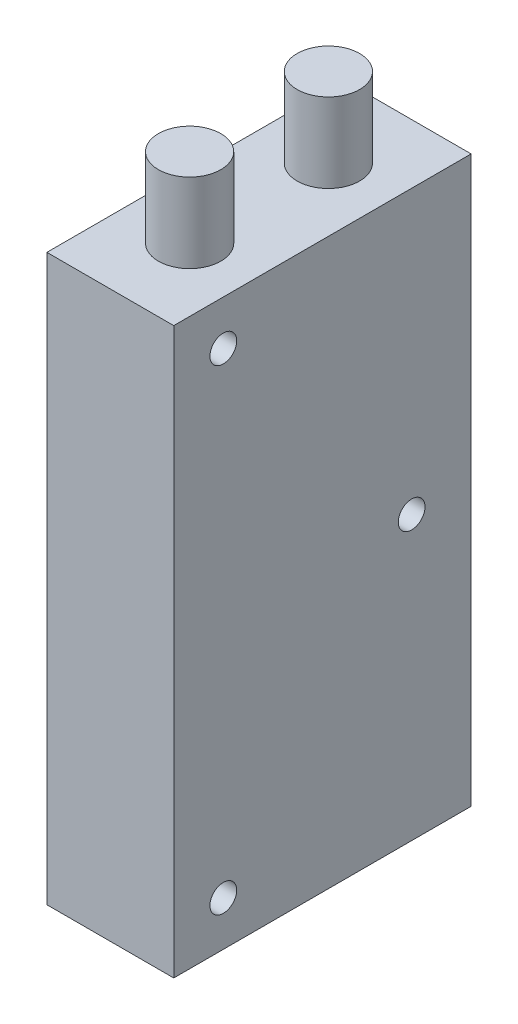
ISO-10303-21;
HEADER;
FILE_DESCRIPTION(('STEP AP214'),'2;1');
FILE_NAME('part.step','',(''),(''),'','','');
FILE_SCHEMA(('AUTOMOTIVE_DESIGN { 1 0 10303 214 1 1 1 1 }'));
ENDSEC;
DATA;
#1=APPLICATION_CONTEXT('core data for automotive mechanical design processes');
#2=APPLICATION_PROTOCOL_DEFINITION('international standard','automotive_design',2000,#1);
#3=PRODUCT_CONTEXT('',#1,'mechanical');
#4=PRODUCT('Part','Part','',(#3));
#5=PRODUCT_RELATED_PRODUCT_CATEGORY('part','',(#4));
#6=PRODUCT_DEFINITION_FORMATION('','',#4);
#7=PRODUCT_DEFINITION_CONTEXT('part definition',#1,'design');
#8=PRODUCT_DEFINITION('design','',#6,#7);
#9=PRODUCT_DEFINITION_SHAPE('','',#8);
#10=(LENGTH_UNIT() NAMED_UNIT(*) SI_UNIT(.MILLI.,.METRE.));
#11=(NAMED_UNIT(*) PLANE_ANGLE_UNIT() SI_UNIT($,.RADIAN.));
#12=(NAMED_UNIT(*) SI_UNIT($,.STERADIAN.) SOLID_ANGLE_UNIT());
#13=UNCERTAINTY_MEASURE_WITH_UNIT(LENGTH_MEASURE(1.E-05),#10,'distance_accuracy_value','');
#14=(GEOMETRIC_REPRESENTATION_CONTEXT(3) GLOBAL_UNCERTAINTY_ASSIGNED_CONTEXT((#13)) GLOBAL_UNIT_ASSIGNED_CONTEXT((#10,
#11,#12)) REPRESENTATION_CONTEXT('',''));
#15=CARTESIAN_POINT('',(0.,0.,0.));
#16=DIRECTION('',(0.,0.,1.));
#17=DIRECTION('',(1.,0.,0.));
#18=AXIS2_PLACEMENT_3D('',#15,#16,#17);
#19=CARTESIAN_POINT('',(-12.8,-28.5,-57.));
#20=DIRECTION('',(0.,-1.,0.));
#21=DIRECTION('',(0.,0.,-1.));
#22=AXIS2_PLACEMENT_3D('',#19,#20,#21);
#23=PLANE('',#22);
#24=DIRECTION('',(0.,0.,-1.));
#25=VECTOR('',#24,1.);
#26=CARTESIAN_POINT('',(0.,-28.5,-57.));
#27=LINE('',#26,#25);
#28=CARTESIAN_POINT('',(0.,-28.5,-57.));
#29=VERTEX_POINT('',#28);
#30=CARTESIAN_POINT('',(0.,-28.5,-87.));
#31=VERTEX_POINT('',#30);
#32=EDGE_CURVE('E108',#29,#31,#27,.T.);
#33=ORIENTED_EDGE('',*,*,#32,.F.);
#34=DIRECTION('',(1.,0.,0.));
#35=VECTOR('',#34,1.);
#36=CARTESIAN_POINT('',(-12.8,-28.5,-57.));
#37=LINE('',#36,#35);
#38=CARTESIAN_POINT('',(-12.8,-28.5,-57.));
#39=VERTEX_POINT('',#38);
#40=EDGE_CURVE('E56',#39,#29,#37,.T.);
#41=ORIENTED_EDGE('',*,*,#40,.F.);
#42=DIRECTION('',(0.,0.,-1.));
#43=VECTOR('',#42,1.);
#44=CARTESIAN_POINT('',(-12.8,-28.5,-57.));
#45=LINE('',#44,#43);
#46=CARTESIAN_POINT('',(-12.8,-28.5,-87.));
#47=VERTEX_POINT('',#46);
#48=EDGE_CURVE('E105',#39,#47,#45,.T.);
#49=ORIENTED_EDGE('',*,*,#48,.T.);
#50=DIRECTION('',(1.,0.,0.));
#51=VECTOR('',#50,1.);
#52=CARTESIAN_POINT('',(-12.8,-28.5,-87.));
#53=LINE('',#52,#51);
#54=EDGE_CURVE('E42',#47,#31,#53,.T.);
#55=ORIENTED_EDGE('',*,*,#54,.T.);
#56=EDGE_LOOP('',(#33,#41,#49,#55));
#57=FACE_BOUND('',#56,.T.);
#58=ADVANCED_FACE('F41',(#57),#23,.T.);
#59=CARTESIAN_POINT('',(-12.8,28.5,-57.));
#60=DIRECTION('',(0.,0.,1.));
#61=DIRECTION('',(1.,0.,0.));
#62=AXIS2_PLACEMENT_3D('',#59,#60,#61);
#63=PLANE('',#62);
#64=DIRECTION('',(0.,-1.,0.));
#65=VECTOR('',#64,1.);
#66=CARTESIAN_POINT('',(0.,28.5,-57.));
#67=LINE('',#66,#65);
#68=CARTESIAN_POINT('',(0.,28.5,-57.));
#69=VERTEX_POINT('',#68);
#70=EDGE_CURVE('E102',#69,#29,#67,.T.);
#71=ORIENTED_EDGE('',*,*,#70,.F.);
#72=DIRECTION('',(1.,0.,0.));
#73=VECTOR('',#72,1.);
#74=CARTESIAN_POINT('',(-12.8,28.5,-57.));
#75=LINE('',#74,#73);
#76=CARTESIAN_POINT('',(-12.8,28.5,-57.));
#77=VERTEX_POINT('',#76);
#78=EDGE_CURVE('E79',#77,#69,#75,.T.);
#79=ORIENTED_EDGE('',*,*,#78,.F.);
#80=DIRECTION('',(0.,-1.,0.));
#81=VECTOR('',#80,1.);
#82=CARTESIAN_POINT('',(-12.8,28.5,-57.));
#83=LINE('',#82,#81);
#84=EDGE_CURVE('E97',#77,#39,#83,.T.);
#85=ORIENTED_EDGE('',*,*,#84,.T.);
#86=ORIENTED_EDGE('',*,*,#40,.T.);
#87=EDGE_LOOP('',(#71,#79,#85,#86));
#88=FACE_BOUND('',#87,.T.);
#89=ADVANCED_FACE('F153',(#88),#63,.T.);
#90=CARTESIAN_POINT('',(-12.8,28.5,-87.));
#91=DIRECTION('',(0.,1.,0.));
#92=DIRECTION('',(0.,0.,1.));
#93=AXIS2_PLACEMENT_3D('',#90,#91,#92);
#94=PLANE('',#93);
#95=CARTESIAN_POINT('',(-6.4,28.5,-65.));
#96=DIRECTION('',(0.,1.,0.));
#97=DIRECTION('',(0.,0.,1.));
#98=AXIS2_PLACEMENT_3D('',#95,#96,#97);
#99=CIRCLE('',#98,3.15);
#100=CARTESIAN_POINT('',(-6.4,28.5,-61.85));
#101=VERTEX_POINT('',#100);
#102=EDGE_CURVE('E11',#101,#101,#99,.T.);
#103=ORIENTED_EDGE('',*,*,#102,.F.);
#104=EDGE_LOOP('',(#103));
#105=FACE_BOUND('',#104,.T.);
#106=CARTESIAN_POINT('',(-6.4,28.5,-79.));
#107=DIRECTION('',(0.,1.,0.));
#108=DIRECTION('',(0.,0.,1.));
#109=AXIS2_PLACEMENT_3D('',#106,#107,#108);
#110=CIRCLE('',#109,3.15);
#111=CARTESIAN_POINT('',(-6.4,28.5,-75.85));
#112=VERTEX_POINT('',#111);
#113=EDGE_CURVE('E49',#112,#112,#110,.T.);
#114=ORIENTED_EDGE('',*,*,#113,.F.);
#115=EDGE_LOOP('',(#114));
#116=FACE_BOUND('',#115,.T.);
#117=DIRECTION('',(0.,0.,1.));
#118=VECTOR('',#117,1.);
#119=CARTESIAN_POINT('',(0.,28.5,-87.));
#120=LINE('',#119,#118);
#121=CARTESIAN_POINT('',(0.,28.5,-87.));
#122=VERTEX_POINT('',#121);
#123=EDGE_CURVE('E94',#122,#69,#120,.T.);
#124=ORIENTED_EDGE('',*,*,#123,.F.);
#125=DIRECTION('',(1.,0.,0.));
#126=VECTOR('',#125,1.);
#127=CARTESIAN_POINT('',(-12.8,28.5,-87.));
#128=LINE('',#127,#126);
#129=CARTESIAN_POINT('',(-12.8,28.5,-87.));
#130=VERTEX_POINT('',#129);
#131=EDGE_CURVE('E90',#130,#122,#128,.T.);
#132=ORIENTED_EDGE('',*,*,#131,.F.);
#133=DIRECTION('',(0.,0.,1.));
#134=VECTOR('',#133,1.);
#135=CARTESIAN_POINT('',(-12.8,28.5,-87.));
#136=LINE('',#135,#134);
#137=EDGE_CURVE('E95',#130,#77,#136,.T.);
#138=ORIENTED_EDGE('',*,*,#137,.T.);
#139=ORIENTED_EDGE('',*,*,#78,.T.);
#140=EDGE_LOOP('',(#124,#132,#138,#139));
#141=FACE_BOUND('',#140,.T.);
#142=ADVANCED_FACE('F93',(#105,#116,#141),#94,.T.);
#143=CARTESIAN_POINT('',(-12.8,-28.5,-87.));
#144=DIRECTION('',(0.,0.,-1.));
#145=DIRECTION('',(-1.,0.,0.));
#146=AXIS2_PLACEMENT_3D('',#143,#144,#145);
#147=PLANE('',#146);
#148=DIRECTION('',(0.,1.,0.));
#149=VECTOR('',#148,1.);
#150=CARTESIAN_POINT('',(0.,-28.5,-87.));
#151=LINE('',#150,#149);
#152=EDGE_CURVE('E115',#31,#122,#151,.T.);
#153=ORIENTED_EDGE('',*,*,#152,.F.);
#154=ORIENTED_EDGE('',*,*,#54,.F.);
#155=DIRECTION('',(0.,1.,0.));
#156=VECTOR('',#155,1.);
#157=CARTESIAN_POINT('',(-12.8,-28.5,-87.));
#158=LINE('',#157,#156);
#159=EDGE_CURVE('E98',#47,#130,#158,.T.);
#160=ORIENTED_EDGE('',*,*,#159,.T.);
#161=ORIENTED_EDGE('',*,*,#131,.T.);
#162=EDGE_LOOP('',(#153,#154,#160,#161));
#163=FACE_BOUND('',#162,.T.);
#164=ADVANCED_FACE('F101',(#163),#147,.T.);
#165=CARTESIAN_POINT('',(-12.8,0.,0.));
#166=DIRECTION('',(1.,0.,0.));
#167=DIRECTION('',(0.,0.,-1.));
#168=AXIS2_PLACEMENT_3D('',#165,#166,#167);
#169=PLANE('',#168);
#170=CARTESIAN_POINT('',(-12.8,0.,-81.));
#171=DIRECTION('',(1.,0.,0.));
#172=DIRECTION('',(0.,0.,-1.));
#173=AXIS2_PLACEMENT_3D('',#170,#171,#172);
#174=CIRCLE('',#173,1.35);
#175=CARTESIAN_POINT('',(-12.8,0.,-82.35));
#176=VERTEX_POINT('',#175);
#177=EDGE_CURVE('E129',#176,#176,#174,.T.);
#178=ORIENTED_EDGE('',*,*,#177,.T.);
#179=EDGE_LOOP('',(#178));
#180=FACE_BOUND('',#179,.T.);
#181=CARTESIAN_POINT('',(-12.8,24.,-62.));
#182=DIRECTION('',(1.,0.,0.));
#183=DIRECTION('',(0.,0.,-1.));
#184=AXIS2_PLACEMENT_3D('',#181,#182,#183);
#185=CIRCLE('',#184,1.35);
#186=CARTESIAN_POINT('',(-12.8,24.,-63.35));
#187=VERTEX_POINT('',#186);
#188=EDGE_CURVE('E137',#187,#187,#185,.T.);
#189=ORIENTED_EDGE('',*,*,#188,.T.);
#190=EDGE_LOOP('',(#189));
#191=FACE_BOUND('',#190,.T.);
#192=CARTESIAN_POINT('',(-12.8,-24.,-62.));
#193=DIRECTION('',(1.,0.,0.));
#194=DIRECTION('',(0.,0.,-1.));
#195=AXIS2_PLACEMENT_3D('',#192,#193,#194);
#196=CIRCLE('',#195,1.35);
#197=CARTESIAN_POINT('',(-12.8,-24.,-63.35));
#198=VERTEX_POINT('',#197);
#199=EDGE_CURVE('E114',#198,#198,#196,.T.);
#200=ORIENTED_EDGE('',*,*,#199,.T.);
#201=EDGE_LOOP('',(#200));
#202=FACE_BOUND('',#201,.T.);
#203=ORIENTED_EDGE('',*,*,#48,.F.);
#204=ORIENTED_EDGE('',*,*,#84,.F.);
#205=ORIENTED_EDGE('',*,*,#137,.F.);
#206=ORIENTED_EDGE('',*,*,#159,.F.);
#207=EDGE_LOOP('',(#203,#204,#205,#206));
#208=FACE_BOUND('',#207,.T.);
#209=ADVANCED_FACE('F100',(#180,#191,#202,#208),#169,.F.);
#210=CARTESIAN_POINT('',(0.,0.,0.));
#211=DIRECTION('',(1.,0.,0.));
#212=DIRECTION('',(0.,0.,-1.));
#213=AXIS2_PLACEMENT_3D('',#210,#211,#212);
#214=PLANE('',#213);
#215=CARTESIAN_POINT('',(0.,0.,-81.));
#216=DIRECTION('',(1.,0.,0.));
#217=DIRECTION('',(0.,0.,-1.));
#218=AXIS2_PLACEMENT_3D('',#215,#216,#217);
#219=CIRCLE('',#218,1.35);
#220=CARTESIAN_POINT('',(0.,0.,-82.35));
#221=VERTEX_POINT('',#220);
#222=EDGE_CURVE('E135',#221,#221,#219,.T.);
#223=ORIENTED_EDGE('',*,*,#222,.F.);
#224=EDGE_LOOP('',(#223));
#225=FACE_BOUND('',#224,.T.);
#226=CARTESIAN_POINT('',(0.,24.,-62.));
#227=DIRECTION('',(1.,0.,0.));
#228=DIRECTION('',(0.,0.,-1.));
#229=AXIS2_PLACEMENT_3D('',#226,#227,#228);
#230=CIRCLE('',#229,1.35);
#231=CARTESIAN_POINT('',(0.,24.,-63.35));
#232=VERTEX_POINT('',#231);
#233=EDGE_CURVE('E131',#232,#232,#230,.T.);
#234=ORIENTED_EDGE('',*,*,#233,.F.);
#235=EDGE_LOOP('',(#234));
#236=FACE_BOUND('',#235,.T.);
#237=CARTESIAN_POINT('',(0.,-24.,-62.));
#238=DIRECTION('',(1.,0.,0.));
#239=DIRECTION('',(0.,0.,-1.));
#240=AXIS2_PLACEMENT_3D('',#237,#238,#239);
#241=CIRCLE('',#240,1.35);
#242=CARTESIAN_POINT('',(0.,-24.,-63.35));
#243=VERTEX_POINT('',#242);
#244=EDGE_CURVE('E139',#243,#243,#241,.T.);
#245=ORIENTED_EDGE('',*,*,#244,.F.);
#246=EDGE_LOOP('',(#245));
#247=FACE_BOUND('',#246,.T.);
#248=ORIENTED_EDGE('',*,*,#32,.T.);
#249=ORIENTED_EDGE('',*,*,#152,.T.);
#250=ORIENTED_EDGE('',*,*,#123,.T.);
#251=ORIENTED_EDGE('',*,*,#70,.T.);
#252=EDGE_LOOP('',(#248,#249,#250,#251));
#253=FACE_BOUND('',#252,.T.);
#254=ADVANCED_FACE('F146',(#225,#236,#247,#253),#214,.T.);
#255=CARTESIAN_POINT('',(-12.8,-24.,-62.));
#256=DIRECTION('',(1.,0.,0.));
#257=DIRECTION('',(0.,0.,-1.));
#258=AXIS2_PLACEMENT_3D('',#255,#256,#257);
#259=CYLINDRICAL_SURFACE('',#258,1.35);
#260=ORIENTED_EDGE('',*,*,#199,.F.);
#261=EDGE_LOOP('',(#260));
#262=FACE_BOUND('',#261,.T.);
#263=ORIENTED_EDGE('',*,*,#244,.T.);
#264=EDGE_LOOP('',(#263));
#265=FACE_BOUND('',#264,.T.);
#266=ADVANCED_FACE('F148',(#262,#265),#259,.F.);
#267=CARTESIAN_POINT('',(-12.8,24.,-62.));
#268=DIRECTION('',(1.,0.,0.));
#269=DIRECTION('',(0.,0.,-1.));
#270=AXIS2_PLACEMENT_3D('',#267,#268,#269);
#271=CYLINDRICAL_SURFACE('',#270,1.35);
#272=ORIENTED_EDGE('',*,*,#188,.F.);
#273=EDGE_LOOP('',(#272));
#274=FACE_BOUND('',#273,.T.);
#275=ORIENTED_EDGE('',*,*,#233,.T.);
#276=EDGE_LOOP('',(#275));
#277=FACE_BOUND('',#276,.T.);
#278=ADVANCED_FACE('F173',(#274,#277),#271,.F.);
#279=CARTESIAN_POINT('',(-12.8,0.,-81.));
#280=DIRECTION('',(1.,0.,0.));
#281=DIRECTION('',(0.,0.,-1.));
#282=AXIS2_PLACEMENT_3D('',#279,#280,#281);
#283=CYLINDRICAL_SURFACE('',#282,1.35);
#284=ORIENTED_EDGE('',*,*,#177,.F.);
#285=EDGE_LOOP('',(#284));
#286=FACE_BOUND('',#285,.T.);
#287=ORIENTED_EDGE('',*,*,#222,.T.);
#288=EDGE_LOOP('',(#287));
#289=FACE_BOUND('',#288,.T.);
#290=ADVANCED_FACE('F178',(#286,#289),#283,.F.);
#291=CARTESIAN_POINT('',(-6.4,36.5,-79.));
#292=DIRECTION('',(0.,-1.,0.));
#293=DIRECTION('',(0.,0.,-1.));
#294=AXIS2_PLACEMENT_3D('',#291,#292,#293);
#295=CYLINDRICAL_SURFACE('',#294,3.15);
#296=CARTESIAN_POINT('',(-6.4,36.5,-79.));
#297=DIRECTION('',(0.,1.,0.));
#298=DIRECTION('',(0.,0.,1.));
#299=AXIS2_PLACEMENT_3D('',#296,#297,#298);
#300=CIRCLE('',#299,3.15);
#301=CARTESIAN_POINT('',(-6.4,36.5,-75.85));
#302=VERTEX_POINT('',#301);
#303=EDGE_CURVE('E121',#302,#302,#300,.T.);
#304=ORIENTED_EDGE('',*,*,#303,.F.);
#305=EDGE_LOOP('',(#304));
#306=FACE_BOUND('',#305,.T.);
#307=ORIENTED_EDGE('',*,*,#113,.T.);
#308=EDGE_LOOP('',(#307));
#309=FACE_BOUND('',#308,.T.);
#310=ADVANCED_FACE('F185',(#306,#309),#295,.T.);
#311=CARTESIAN_POINT('',(-6.4,36.5,-79.));
#312=DIRECTION('',(0.,1.,0.));
#313=DIRECTION('',(0.,0.,1.));
#314=AXIS2_PLACEMENT_3D('',#311,#312,#313);
#315=PLANE('',#314);
#316=ORIENTED_EDGE('',*,*,#303,.T.);
#317=EDGE_LOOP('',(#316));
#318=FACE_BOUND('',#317,.T.);
#319=ADVANCED_FACE('F184',(#318),#315,.T.);
#320=CARTESIAN_POINT('',(-6.4,36.5,-65.));
#321=DIRECTION('',(0.,-1.,0.));
#322=DIRECTION('',(0.,0.,-1.));
#323=AXIS2_PLACEMENT_3D('',#320,#321,#322);
#324=CYLINDRICAL_SURFACE('',#323,3.15);
#325=CARTESIAN_POINT('',(-6.4,36.5,-65.));
#326=DIRECTION('',(0.,1.,0.));
#327=DIRECTION('',(0.,0.,1.));
#328=AXIS2_PLACEMENT_3D('',#325,#326,#327);
#329=CIRCLE('',#328,3.15);
#330=CARTESIAN_POINT('',(-6.4,36.5,-61.85));
#331=VERTEX_POINT('',#330);
#332=EDGE_CURVE('E126',#331,#331,#329,.T.);
#333=ORIENTED_EDGE('',*,*,#332,.F.);
#334=EDGE_LOOP('',(#333));
#335=FACE_BOUND('',#334,.T.);
#336=ORIENTED_EDGE('',*,*,#102,.T.);
#337=EDGE_LOOP('',(#336));
#338=FACE_BOUND('',#337,.T.);
#339=ADVANCED_FACE('F186',(#335,#338),#324,.T.);
#340=CARTESIAN_POINT('',(-6.4,36.5,-65.));
#341=DIRECTION('',(0.,1.,0.));
#342=DIRECTION('',(0.,0.,1.));
#343=AXIS2_PLACEMENT_3D('',#340,#341,#342);
#344=PLANE('',#343);
#345=ORIENTED_EDGE('',*,*,#332,.T.);
#346=EDGE_LOOP('',(#345));
#347=FACE_BOUND('',#346,.T.);
#348=ADVANCED_FACE('F194',(#347),#344,.T.);
#349=CLOSED_SHELL('',(#58,#89,#142,#164,#209,#254,#266,#278,#290,#310,#319,#339,#348));
#350=MANIFOLD_SOLID_BREP('B2',#349);
#351=ADVANCED_BREP_SHAPE_REPRESENTATION('',(#18,#350),#14);
#352=SHAPE_DEFINITION_REPRESENTATION(#9,#351);
ENDSEC;
END-ISO-10303-21;
